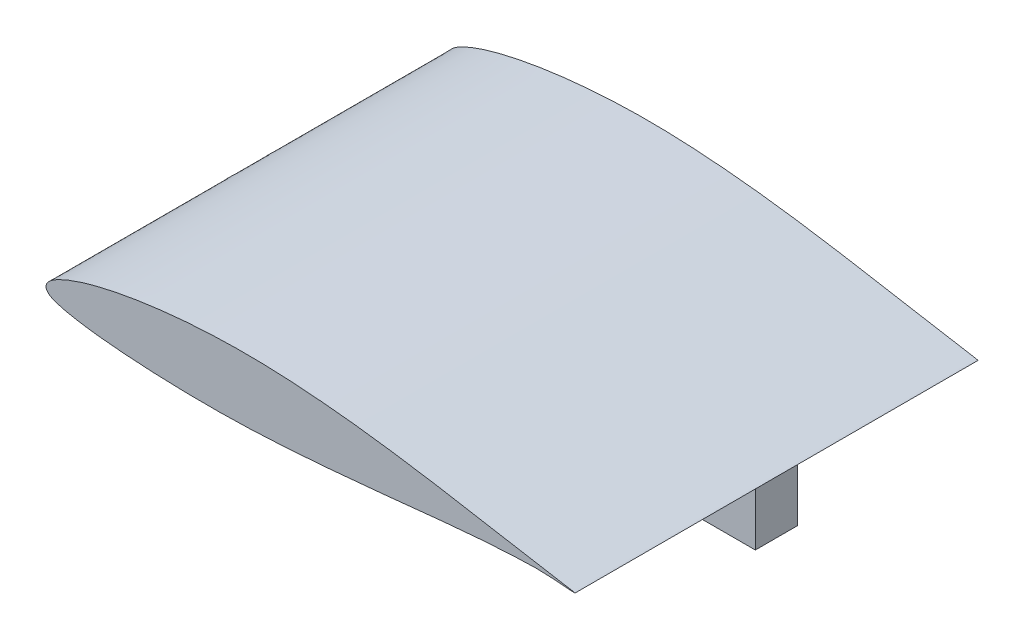
ISO-10303-21;
HEADER;
FILE_DESCRIPTION(('STEP AP214'),'2;1');
FILE_NAME('part.step','',(''),(''),'','','');
FILE_SCHEMA(('AUTOMOTIVE_DESIGN { 1 0 10303 214 1 1 1 1 }'));
ENDSEC;
DATA;
#1=APPLICATION_CONTEXT('core data for automotive mechanical design processes');
#2=APPLICATION_PROTOCOL_DEFINITION('international standard','automotive_design',2000,#1);
#3=PRODUCT_CONTEXT('',#1,'mechanical');
#4=PRODUCT('Part','Part','',(#3));
#5=PRODUCT_RELATED_PRODUCT_CATEGORY('part','',(#4));
#6=PRODUCT_DEFINITION_FORMATION('','',#4);
#7=PRODUCT_DEFINITION_CONTEXT('part definition',#1,'design');
#8=PRODUCT_DEFINITION('design','',#6,#7);
#9=PRODUCT_DEFINITION_SHAPE('','',#8);
#10=(LENGTH_UNIT() NAMED_UNIT(*) SI_UNIT(.MILLI.,.METRE.));
#11=(NAMED_UNIT(*) PLANE_ANGLE_UNIT() SI_UNIT($,.RADIAN.));
#12=(NAMED_UNIT(*) SI_UNIT($,.STERADIAN.) SOLID_ANGLE_UNIT());
#13=UNCERTAINTY_MEASURE_WITH_UNIT(LENGTH_MEASURE(1.E-05),#10,'distance_accuracy_value','');
#14=(GEOMETRIC_REPRESENTATION_CONTEXT(3) GLOBAL_UNCERTAINTY_ASSIGNED_CONTEXT((#13)) GLOBAL_UNIT_ASSIGNED_CONTEXT((#10,
#11,#12)) REPRESENTATION_CONTEXT('',''));
#15=CARTESIAN_POINT('',(0.,0.,0.));
#16=DIRECTION('',(0.,0.,1.));
#17=DIRECTION('',(1.,0.,0.));
#18=AXIS2_PLACEMENT_3D('',#15,#16,#17);
#19=CARTESIAN_POINT('',(100.,0.,76.2));
#20=CARTESIAN_POINT('',(100.014170612076,0.0802355680645147,76.2));
#21=CARTESIAN_POINT('',(94.2513787386886,0.987922299528687,76.2));
#22=CARTESIAN_POINT('',(90.2528823393263,1.70531359571479,76.2));
#23=CARTESIAN_POINT('',(85.0126298463887,2.62809451049511,76.2));
#24=CARTESIAN_POINT('',(80.0978733834121,3.49360580103763,76.2));
#25=CARTESIAN_POINT('',(75.08626384572,4.3518511124799,76.2));
#26=CARTESIAN_POINT('',(70.0899657920977,5.16318276739783,76.2));
#27=CARTESIAN_POINT('',(65.0788997815026,5.91295297026844,76.2));
#28=CARTESIAN_POINT('',(60.0607717531889,6.57756010593191,76.2));
#29=CARTESIAN_POINT('',(55.035513209883,7.14691319987309,76.2));
#30=CARTESIAN_POINT('',(50.002522389741,7.58284746732128,76.2));
#31=CARTESIAN_POINT('',(44.9667855949776,7.92273212264344,76.2));
#32=CARTESIAN_POINT('',(39.9247260923384,8.08968450716043,76.2));
#33=CARTESIAN_POINT('',(34.8802854626848,8.09045706042397,76.2));
#34=CARTESIAN_POINT('',(29.8355416107328,7.90223367255034,76.2));
#35=CARTESIAN_POINT('',(24.7925671750228,7.53116390095195,76.2));
#36=CARTESIAN_POINT('',(19.752173403588,6.9630929580199,76.2));
#37=CARTESIAN_POINT('',(14.7144159850358,6.18032644748818,76.2));
#38=CARTESIAN_POINT('',(10.5311953688536,5.30031427403274,76.2));
#39=CARTESIAN_POINT('',(7.2000089786032,4.39841068347721,76.2));
#40=CARTESIAN_POINT('',(4.69274087463174,3.57023875238834,76.2));
#41=CARTESIAN_POINT('',(2.61801180984859,2.68942559379691,76.2));
#42=CARTESIAN_POINT('',(1.24233146474951,1.90086330766204,76.2));
#43=CARTESIAN_POINT('',(0.62785372555261,1.389017566799,76.2));
#44=CARTESIAN_POINT('',(0.150010633222135,0.895649072609858,76.2));
#45=CARTESIAN_POINT('',(-0.232912194690845,-0.0403967273184171,76.2));
#46=CARTESIAN_POINT('',(0.445072625408608,-0.743635565464356,76.2));
#47=CARTESIAN_POINT('',(1.00461536523782,-1.08960973246923,76.2));
#48=CARTESIAN_POINT('',(1.6909830569623,-1.40687657859132,76.2));
#49=CARTESIAN_POINT('',(3.13471178954102,-1.85123526856676,76.2));
#50=CARTESIAN_POINT('',(5.2530393591784,-2.29801568892207,76.2));
#51=CARTESIAN_POINT('',(7.77242069880457,-2.69943017094629,76.2));
#52=CARTESIAN_POINT('',(11.1031895892123,-3.10430685655371,76.2));
#53=CARTESIAN_POINT('',(15.2552831112773,-3.46844948271059,76.2));
#54=CARTESIAN_POINT('',(20.2303760452594,-3.7658553603725,76.2));
#55=CARTESIAN_POINT('',(25.197065528373,-3.93635761837658,76.2));
#56=CARTESIAN_POINT('',(30.1571302193971,-4.00212887099721,76.2));
#57=CARTESIAN_POINT('',(35.1171580754506,-3.95900552316446,76.2));
#58=CARTESIAN_POINT('',(40.0765072798799,-3.79516179753949,76.2));
#59=CARTESIAN_POINT('',(45.0396701822184,-3.52806165927051,76.2));
#60=CARTESIAN_POINT('',(50.0039593179771,-3.17474110651785,76.2));
#61=CARTESIAN_POINT('',(54.9729843905619,-2.75476065904624,76.2));
#62=CARTESIAN_POINT('',(59.9453585339621,-2.27374874279989,76.2));
#63=CARTESIAN_POINT('',(64.9299596006109,-1.81576012468662,76.2));
#64=CARTESIAN_POINT('',(69.9147136518121,-1.2535452669803,76.2));
#65=CARTESIAN_POINT('',(74.9074278185698,-0.758100622870828,76.2));
#66=CARTESIAN_POINT('',(79.930586701521,-0.297188344024867,76.2));
#67=CARTESIAN_POINT('',(84.8732501786619,0.0994656121755126,76.2));
#68=CARTESIAN_POINT('',(90.1543016761278,0.343218326510209,76.2));
#69=CARTESIAN_POINT('',(94.2140904280993,0.501588878716901,76.2));
#70=CARTESIAN_POINT('',(99.9858869882734,-0.0799094285351732,76.2));
#71=CARTESIAN_POINT('',(100.,0.,76.2));
#72=B_SPLINE_CURVE_WITH_KNOTS('',3,(#19,#20,#21,#22,#23,#24,#25,#26,#27,#28,#29,#30,#31,#32,#33,
#34,#35,#36,#37,#38,#39,#40,#41,#42,#43,#44,#45,#46,#47,#48,#49,#50,#51,#52,#53,#54,#55,#56,#57,
#58,#59,#60,#61,#62,#63,#64,#65,#66,#67,#68,#69,#70,#71),.UNSPECIFIED.,.T.,.F.,(4,1,1,1,1,1,1,1,
1,1,1,1,1,1,1,1,1,1,1,1,1,1,1,1,1,1,1,1,1,1,1,1,1,1,1,1,1,1,1,1,1,1,1,1,1,1,1,1,1,1,4),(0.,
0.0248401600611186,0.0496463377780271,0.074494465889176,0.0993722184500314,0.124275131601442,
0.149177344479998,0.17407575109908,0.198956347188206,0.223811552141009,0.24863208011981,
0.273434063374411,0.298217341355184,0.322996695872583,0.347793082809583,0.372630344631579,
0.397533352832358,0.422557523624735,0.447773674833146,0.460511709195307,0.473423431452883,
0.486680029949691,0.493678335237496,0.496723305930385,0.498392544685542,0.503909017545475,
0.509291639706998,0.510852916826505,0.513717227633189,0.520364252182127,0.53310336730154,
0.545593679011817,0.557974245778616,0.582563734905974,0.607033396930618,0.63144930352205,
0.655827750547501,0.680164809757272,0.704574632581273,0.728980583418809,0.753442063272876,
0.777949314003769,0.802501977795434,0.827094468513553,0.851753396926096,0.876439602756972,
0.901138992044575,0.925852145633311,0.950560092379754,0.975260809599925,1.),.UNSPECIFIED.);
#73=DIRECTION('',(0.,0.,-1.));
#74=VECTOR('',#73,1.);
#75=SURFACE_OF_LINEAR_EXTRUSION('',#72,#74);
#76=CARTESIAN_POINT('',(100.,0.,0.));
#77=CARTESIAN_POINT('',(100.014170612076,0.0802355680645147,0.));
#78=CARTESIAN_POINT('',(94.2513787386886,0.987922299528687,0.));
#79=CARTESIAN_POINT('',(90.2528823393263,1.70531359571479,0.));
#80=CARTESIAN_POINT('',(85.0126298463887,2.62809451049511,0.));
#81=CARTESIAN_POINT('',(80.0978733834121,3.49360580103763,0.));
#82=CARTESIAN_POINT('',(75.08626384572,4.3518511124799,0.));
#83=CARTESIAN_POINT('',(70.0899657920977,5.16318276739783,0.));
#84=CARTESIAN_POINT('',(65.0788997815026,5.91295297026844,0.));
#85=CARTESIAN_POINT('',(60.0607717531889,6.57756010593191,0.));
#86=CARTESIAN_POINT('',(55.035513209883,7.14691319987309,0.));
#87=CARTESIAN_POINT('',(50.002522389741,7.58284746732128,0.));
#88=CARTESIAN_POINT('',(44.9667855949776,7.92273212264344,0.));
#89=CARTESIAN_POINT('',(39.9247260923384,8.08968450716043,0.));
#90=CARTESIAN_POINT('',(34.8802854626848,8.09045706042397,0.));
#91=CARTESIAN_POINT('',(29.8355416107328,7.90223367255034,0.));
#92=CARTESIAN_POINT('',(24.7925671750228,7.53116390095195,0.));
#93=CARTESIAN_POINT('',(19.752173403588,6.9630929580199,0.));
#94=CARTESIAN_POINT('',(14.7144159850358,6.18032644748818,0.));
#95=CARTESIAN_POINT('',(10.5311953688536,5.30031427403274,0.));
#96=CARTESIAN_POINT('',(7.2000089786032,4.39841068347721,0.));
#97=CARTESIAN_POINT('',(4.69274087463174,3.57023875238834,0.));
#98=CARTESIAN_POINT('',(2.61801180984859,2.68942559379691,0.));
#99=CARTESIAN_POINT('',(1.24233146474951,1.90086330766204,0.));
#100=CARTESIAN_POINT('',(0.62785372555261,1.389017566799,0.));
#101=CARTESIAN_POINT('',(0.150010633222135,0.895649072609858,0.));
#102=CARTESIAN_POINT('',(-0.232912194690845,-0.0403967273184171,0.));
#103=CARTESIAN_POINT('',(0.445072625408608,-0.743635565464356,0.));
#104=CARTESIAN_POINT('',(1.00461536523782,-1.08960973246923,0.));
#105=CARTESIAN_POINT('',(1.6909830569623,-1.40687657859132,0.));
#106=CARTESIAN_POINT('',(3.13471178954102,-1.85123526856676,0.));
#107=CARTESIAN_POINT('',(5.2530393591784,-2.29801568892207,0.));
#108=CARTESIAN_POINT('',(7.77242069880457,-2.69943017094629,0.));
#109=CARTESIAN_POINT('',(11.1031895892123,-3.10430685655371,0.));
#110=CARTESIAN_POINT('',(15.2552831112773,-3.46844948271059,0.));
#111=CARTESIAN_POINT('',(20.2303760452594,-3.7658553603725,0.));
#112=CARTESIAN_POINT('',(25.197065528373,-3.93635761837658,0.));
#113=CARTESIAN_POINT('',(30.1571302193971,-4.00212887099721,0.));
#114=CARTESIAN_POINT('',(35.1171580754506,-3.95900552316446,0.));
#115=CARTESIAN_POINT('',(40.0765072798799,-3.79516179753949,0.));
#116=CARTESIAN_POINT('',(45.0396701822184,-3.52806165927051,0.));
#117=CARTESIAN_POINT('',(50.0039593179771,-3.17474110651785,0.));
#118=CARTESIAN_POINT('',(54.9729843905619,-2.75476065904624,0.));
#119=CARTESIAN_POINT('',(59.9453585339621,-2.27374874279989,0.));
#120=CARTESIAN_POINT('',(64.9299596006109,-1.81576012468662,0.));
#121=CARTESIAN_POINT('',(69.9147136518121,-1.2535452669803,0.));
#122=CARTESIAN_POINT('',(74.9074278185698,-0.758100622870828,0.));
#123=CARTESIAN_POINT('',(79.930586701521,-0.297188344024867,0.));
#124=CARTESIAN_POINT('',(84.8732501786619,0.0994656121755126,0.));
#125=CARTESIAN_POINT('',(90.1543016761278,0.343218326510209,0.));
#126=CARTESIAN_POINT('',(94.2140904280993,0.501588878716901,0.));
#127=CARTESIAN_POINT('',(99.9858869882734,-0.0799094285351732,0.));
#128=CARTESIAN_POINT('',(100.,0.,0.));
#129=B_SPLINE_CURVE_WITH_KNOTS('',3,(#76,#77,#78,#79,#80,#81,#82,#83,#84,#85,#86,#87,#88,#89,
#90,#91,#92,#93,#94,#95,#96,#97,#98,#99,#100,#101,#102,#103,#104,#105,#106,#107,#108,#109,#110,
#111,#112,#113,#114,#115,#116,#117,#118,#119,#120,#121,#122,#123,#124,#125,#126,#127,#128),
.UNSPECIFIED.,.T.,.F.,(4,1,1,1,1,1,1,1,1,1,1,1,1,1,1,1,1,1,1,1,1,1,1,1,1,1,1,1,1,1,1,1,1,1,1,1,
1,1,1,1,1,1,1,1,1,1,1,1,1,1,4),(0.,0.0248401600611186,0.0496463377780271,0.074494465889176,
0.0993722184500314,0.124275131601442,0.149177344479998,0.17407575109908,0.198956347188206,
0.223811552141009,0.24863208011981,0.273434063374411,0.298217341355184,0.322996695872583,
0.347793082809583,0.372630344631579,0.397533352832358,0.422557523624735,0.447773674833146,
0.460511709195307,0.473423431452883,0.486680029949691,0.493678335237496,0.496723305930385,
0.498392544685542,0.503909017545475,0.509291639706998,0.510852916826505,0.513717227633189,
0.520364252182127,0.53310336730154,0.545593679011817,0.557974245778616,0.582563734905974,
0.607033396930618,0.63144930352205,0.655827750547501,0.680164809757272,0.704574632581273,
0.728980583418809,0.753442063272876,0.777949314003769,0.802501977795434,0.827094468513553,
0.851753396926096,0.876439602756972,0.901138992044575,0.925852145633311,0.950560092379754,
0.975260809599925,1.),.UNSPECIFIED.);
#130=CARTESIAN_POINT('',(100.,0.,0.));
#131=VERTEX_POINT('',#130);
#132=EDGE_CURVE('E143',#131,#131,#129,.T.);
#133=ORIENTED_EDGE('',*,*,#132,.T.);
#134=EDGE_LOOP('',(#133));
#135=FACE_BOUND('',#134,.T.);
#136=CARTESIAN_POINT('',(100.,0.,76.2));
#137=VERTEX_POINT('',#136);
#138=EDGE_CURVE('E148',#137,#137,#72,.T.);
#139=ORIENTED_EDGE('',*,*,#138,.F.);
#140=EDGE_LOOP('',(#139));
#141=FACE_BOUND('',#140,.T.);
#142=DIRECTION('',(0.,0.,1.));
#143=VECTOR('',#142,1.);
#144=CARTESIAN_POINT('',(5.11968690379794E-05,-0.000267551796485818,34.1));
#145=LINE('',#144,#143);
#146=CARTESIAN_POINT('',(5.11968690380142E-05,-0.000267551796485723,34.1));
#147=VERTEX_POINT('',#146);
#148=CARTESIAN_POINT('',(5.11968690379794E-05,-0.000267551796485818,42.1));
#149=VERTEX_POINT('',#148);
#150=EDGE_CURVE('E135',#147,#149,#145,.T.);
#151=ORIENTED_EDGE('',*,*,#150,.T.);
#152=CARTESIAN_POINT('',(100.,0.,42.1));
#153=CARTESIAN_POINT('',(100.014170612076,0.0802355680645147,42.1));
#154=CARTESIAN_POINT('',(94.2513787386886,0.987922299528687,42.1));
#155=CARTESIAN_POINT('',(90.2528823393263,1.70531359571479,42.1));
#156=CARTESIAN_POINT('',(85.0126298463887,2.62809451049511,42.1));
#157=CARTESIAN_POINT('',(80.0978733834121,3.49360580103763,42.1));
#158=CARTESIAN_POINT('',(75.08626384572,4.3518511124799,42.1));
#159=CARTESIAN_POINT('',(70.0899657920977,5.16318276739783,42.1));
#160=CARTESIAN_POINT('',(65.0788997815026,5.91295297026844,42.1));
#161=CARTESIAN_POINT('',(60.0607717531889,6.57756010593191,42.1));
#162=CARTESIAN_POINT('',(55.035513209883,7.14691319987309,42.1));
#163=CARTESIAN_POINT('',(50.002522389741,7.58284746732128,42.1));
#164=CARTESIAN_POINT('',(44.9667855949776,7.92273212264344,42.1));
#165=CARTESIAN_POINT('',(39.9247260923384,8.08968450716043,42.1));
#166=CARTESIAN_POINT('',(34.8802854626848,8.09045706042397,42.1));
#167=CARTESIAN_POINT('',(29.8355416107328,7.90223367255034,42.1));
#168=CARTESIAN_POINT('',(24.7925671750228,7.53116390095195,42.1));
#169=CARTESIAN_POINT('',(19.752173403588,6.9630929580199,42.1));
#170=CARTESIAN_POINT('',(14.7144159850358,6.18032644748818,42.1));
#171=CARTESIAN_POINT('',(10.5311953688536,5.30031427403274,42.1));
#172=CARTESIAN_POINT('',(7.2000089786032,4.39841068347721,42.1));
#173=CARTESIAN_POINT('',(4.69274087463174,3.57023875238834,42.1));
#174=CARTESIAN_POINT('',(2.61801180984859,2.68942559379691,42.1));
#175=CARTESIAN_POINT('',(1.24233146474951,1.90086330766204,42.1));
#176=CARTESIAN_POINT('',(0.62785372555261,1.389017566799,42.1));
#177=CARTESIAN_POINT('',(0.150010633222135,0.895649072609858,42.1));
#178=CARTESIAN_POINT('',(-0.232912194690845,-0.0403967273184171,42.1));
#179=CARTESIAN_POINT('',(0.445072625408608,-0.743635565464356,42.1));
#180=CARTESIAN_POINT('',(1.00461536523782,-1.08960973246923,42.1));
#181=CARTESIAN_POINT('',(1.6909830569623,-1.40687657859132,42.1));
#182=CARTESIAN_POINT('',(3.13471178954102,-1.85123526856676,42.1));
#183=CARTESIAN_POINT('',(5.2530393591784,-2.29801568892207,42.1));
#184=CARTESIAN_POINT('',(7.77242069880457,-2.69943017094629,42.1));
#185=CARTESIAN_POINT('',(11.1031895892123,-3.10430685655371,42.1));
#186=CARTESIAN_POINT('',(15.2552831112773,-3.46844948271059,42.1));
#187=CARTESIAN_POINT('',(20.2303760452594,-3.7658553603725,42.1));
#188=CARTESIAN_POINT('',(25.197065528373,-3.93635761837658,42.1));
#189=CARTESIAN_POINT('',(30.1571302193971,-4.00212887099721,42.1));
#190=CARTESIAN_POINT('',(35.1171580754506,-3.95900552316446,42.1));
#191=CARTESIAN_POINT('',(40.0765072798799,-3.79516179753949,42.1));
#192=CARTESIAN_POINT('',(45.0396701822184,-3.52806165927051,42.1));
#193=CARTESIAN_POINT('',(50.0039593179771,-3.17474110651785,42.1));
#194=CARTESIAN_POINT('',(54.9729843905619,-2.75476065904624,42.1));
#195=CARTESIAN_POINT('',(59.9453585339621,-2.27374874279989,42.1));
#196=CARTESIAN_POINT('',(64.9299596006109,-1.81576012468662,42.1));
#197=CARTESIAN_POINT('',(69.9147136518121,-1.2535452669803,42.1));
#198=CARTESIAN_POINT('',(74.9074278185698,-0.758100622870828,42.1));
#199=CARTESIAN_POINT('',(79.930586701521,-0.297188344024867,42.1));
#200=CARTESIAN_POINT('',(84.8732501786619,0.0994656121755126,42.1));
#201=CARTESIAN_POINT('',(90.1543016761278,0.343218326510209,42.1));
#202=CARTESIAN_POINT('',(94.2140904280993,0.501588878716901,42.1));
#203=CARTESIAN_POINT('',(99.9858869882734,-0.0799094285351732,42.1));
#204=CARTESIAN_POINT('',(100.,0.,42.1));
#205=B_SPLINE_CURVE_WITH_KNOTS('',3,(#152,#153,#154,#155,#156,#157,#158,#159,#160,#161,#162,
#163,#164,#165,#166,#167,#168,#169,#170,#171,#172,#173,#174,#175,#176,#177,#178,#179,#180,#181,
#182,#183,#184,#185,#186,#187,#188,#189,#190,#191,#192,#193,#194,#195,#196,#197,#198,#199,#200,
#201,#202,#203,#204),.UNSPECIFIED.,.T.,.F.,(4,1,1,1,1,1,1,1,1,1,1,1,1,1,1,1,1,1,1,1,1,1,1,1,1,1,
1,1,1,1,1,1,1,1,1,1,1,1,1,1,1,1,1,1,1,1,1,1,1,1,4),(0.,0.0248401600611186,0.0496463377780271,
0.074494465889176,0.0993722184500314,0.124275131601442,0.149177344479998,0.17407575109908,
0.198956347188206,0.223811552141009,0.24863208011981,0.273434063374411,0.298217341355184,
0.322996695872583,0.347793082809583,0.372630344631579,0.397533352832358,0.422557523624735,
0.447773674833146,0.460511709195307,0.473423431452883,0.486680029949691,0.493678335237496,
0.496723305930385,0.498392544685542,0.503909017545475,0.509291639706998,0.510852916826505,
0.513717227633189,0.520364252182127,0.53310336730154,0.545593679011817,0.557974245778616,
0.582563734905974,0.607033396930618,0.63144930352205,0.655827750547501,0.680164809757272,
0.704574632581273,0.728980583418809,0.753442063272876,0.777949314003769,0.802501977795434,
0.827094468513553,0.851753396926096,0.876439602756972,0.901138992044575,0.925852145633311,
0.950560092379754,0.975260809599925,1.),.UNSPECIFIED.);
#206=CARTESIAN_POINT('',(100.000050626666,0.000526352267182232,42.1));
#207=VERTEX_POINT('',#206);
#208=EDGE_CURVE('E111',#207,#149,#205,.F.);
#209=ORIENTED_EDGE('',*,*,#208,.F.);
#210=DIRECTION('',(0.,0.,1.));
#211=VECTOR('',#210,1.);
#212=CARTESIAN_POINT('',(100.000052030593,0.000596232654725544,34.1));
#213=LINE('',#212,#211);
#214=CARTESIAN_POINT('',(100.000052030593,0.000596232363180802,34.1));
#215=VERTEX_POINT('',#214);
#216=EDGE_CURVE('E83',#215,#207,#213,.T.);
#217=ORIENTED_EDGE('',*,*,#216,.F.);
#218=CARTESIAN_POINT('',(100.,0.,34.1));
#219=CARTESIAN_POINT('',(100.014170612076,0.0802355680645147,34.1));
#220=CARTESIAN_POINT('',(94.2513787386886,0.987922299528687,34.1));
#221=CARTESIAN_POINT('',(90.2528823393263,1.70531359571479,34.1));
#222=CARTESIAN_POINT('',(85.0126298463887,2.62809451049511,34.1));
#223=CARTESIAN_POINT('',(80.0978733834121,3.49360580103763,34.1));
#224=CARTESIAN_POINT('',(75.08626384572,4.3518511124799,34.1));
#225=CARTESIAN_POINT('',(70.0899657920977,5.16318276739783,34.1));
#226=CARTESIAN_POINT('',(65.0788997815026,5.91295297026844,34.1));
#227=CARTESIAN_POINT('',(60.0607717531889,6.57756010593191,34.1));
#228=CARTESIAN_POINT('',(55.035513209883,7.14691319987309,34.1));
#229=CARTESIAN_POINT('',(50.002522389741,7.58284746732128,34.1));
#230=CARTESIAN_POINT('',(44.9667855949776,7.92273212264344,34.1));
#231=CARTESIAN_POINT('',(39.9247260923384,8.08968450716043,34.1));
#232=CARTESIAN_POINT('',(34.8802854626848,8.09045706042397,34.1));
#233=CARTESIAN_POINT('',(29.8355416107328,7.90223367255034,34.1));
#234=CARTESIAN_POINT('',(24.7925671750228,7.53116390095195,34.1));
#235=CARTESIAN_POINT('',(19.752173403588,6.9630929580199,34.1));
#236=CARTESIAN_POINT('',(14.7144159850358,6.18032644748818,34.1));
#237=CARTESIAN_POINT('',(10.5311953688536,5.30031427403274,34.1));
#238=CARTESIAN_POINT('',(7.2000089786032,4.39841068347721,34.1));
#239=CARTESIAN_POINT('',(4.69274087463174,3.57023875238834,34.1));
#240=CARTESIAN_POINT('',(2.61801180984859,2.68942559379691,34.1));
#241=CARTESIAN_POINT('',(1.24233146474951,1.90086330766204,34.1));
#242=CARTESIAN_POINT('',(0.62785372555261,1.389017566799,34.1));
#243=CARTESIAN_POINT('',(0.150010633222135,0.895649072609858,34.1));
#244=CARTESIAN_POINT('',(-0.232912194690845,-0.0403967273184171,34.1));
#245=CARTESIAN_POINT('',(0.445072625408608,-0.743635565464356,34.1));
#246=CARTESIAN_POINT('',(1.00461536523782,-1.08960973246923,34.1));
#247=CARTESIAN_POINT('',(1.6909830569623,-1.40687657859132,34.1));
#248=CARTESIAN_POINT('',(3.13471178954102,-1.85123526856676,34.1));
#249=CARTESIAN_POINT('',(5.2530393591784,-2.29801568892207,34.1));
#250=CARTESIAN_POINT('',(7.77242069880457,-2.69943017094629,34.1));
#251=CARTESIAN_POINT('',(11.1031895892123,-3.10430685655371,34.1));
#252=CARTESIAN_POINT('',(15.2552831112773,-3.46844948271059,34.1));
#253=CARTESIAN_POINT('',(20.2303760452594,-3.7658553603725,34.1));
#254=CARTESIAN_POINT('',(25.197065528373,-3.93635761837658,34.1));
#255=CARTESIAN_POINT('',(30.1571302193971,-4.00212887099721,34.1));
#256=CARTESIAN_POINT('',(35.1171580754506,-3.95900552316446,34.1));
#257=CARTESIAN_POINT('',(40.0765072798799,-3.79516179753949,34.1));
#258=CARTESIAN_POINT('',(45.0396701822184,-3.52806165927051,34.1));
#259=CARTESIAN_POINT('',(50.0039593179771,-3.17474110651785,34.1));
#260=CARTESIAN_POINT('',(54.9729843905619,-2.75476065904624,34.1));
#261=CARTESIAN_POINT('',(59.9453585339621,-2.27374874279989,34.1));
#262=CARTESIAN_POINT('',(64.9299596006109,-1.81576012468662,34.1));
#263=CARTESIAN_POINT('',(69.9147136518121,-1.2535452669803,34.1));
#264=CARTESIAN_POINT('',(74.9074278185698,-0.758100622870828,34.1));
#265=CARTESIAN_POINT('',(79.930586701521,-0.297188344024867,34.1));
#266=CARTESIAN_POINT('',(84.8732501786619,0.0994656121755126,34.1));
#267=CARTESIAN_POINT('',(90.1543016761278,0.343218326510209,34.1));
#268=CARTESIAN_POINT('',(94.2140904280993,0.501588878716901,34.1));
#269=CARTESIAN_POINT('',(99.9858869882734,-0.0799094285351732,34.1));
#270=CARTESIAN_POINT('',(100.,0.,34.1));
#271=B_SPLINE_CURVE_WITH_KNOTS('',3,(#218,#219,#220,#221,#222,#223,#224,#225,#226,#227,#228,
#229,#230,#231,#232,#233,#234,#235,#236,#237,#238,#239,#240,#241,#242,#243,#244,#245,#246,#247,
#248,#249,#250,#251,#252,#253,#254,#255,#256,#257,#258,#259,#260,#261,#262,#263,#264,#265,#266,
#267,#268,#269,#270),.UNSPECIFIED.,.T.,.F.,(4,1,1,1,1,1,1,1,1,1,1,1,1,1,1,1,1,1,1,1,1,1,1,1,1,1,
1,1,1,1,1,1,1,1,1,1,1,1,1,1,1,1,1,1,1,1,1,1,1,1,4),(0.,0.0248401600611186,0.0496463377780271,
0.074494465889176,0.0993722184500314,0.124275131601442,0.149177344479998,0.17407575109908,
0.198956347188206,0.223811552141009,0.24863208011981,0.273434063374411,0.298217341355184,
0.322996695872583,0.347793082809583,0.372630344631579,0.397533352832358,0.422557523624735,
0.447773674833146,0.460511709195307,0.473423431452883,0.486680029949691,0.493678335237496,
0.496723305930385,0.498392544685542,0.503909017545475,0.509291639706998,0.510852916826505,
0.513717227633189,0.520364252182127,0.53310336730154,0.545593679011817,0.557974245778616,
0.582563734905974,0.607033396930618,0.63144930352205,0.655827750547501,0.680164809757272,
0.704574632581273,0.728980583418809,0.753442063272876,0.777949314003769,0.802501977795434,
0.827094468513553,0.851753396926096,0.876439602756972,0.901138992044575,0.925852145633311,
0.950560092379754,0.975260809599925,1.),.UNSPECIFIED.);
#272=CARTESIAN_POINT('',(99.5165882488397,0.000592056569787649,34.1));
#273=VERTEX_POINT('',#272);
#274=EDGE_CURVE('E98',#215,#273,#271,.F.);
#275=ORIENTED_EDGE('',*,*,#274,.T.);
#276=DIRECTION('',(0.,0.,-1.));
#277=VECTOR('',#276,1.);
#278=CARTESIAN_POINT('',(99.5165882488397,0.000592056569787649,76.2));
#279=LINE('',#278,#277);
#280=CARTESIAN_POINT('',(99.5165882488397,0.000592056569787649,38.1));
#281=VERTEX_POINT('',#280);
#282=EDGE_CURVE('E100',#273,#281,#279,.F.);
#283=ORIENTED_EDGE('',*,*,#282,.T.);
#284=CARTESIAN_POINT('',(100.,0.,38.1));
#285=CARTESIAN_POINT('',(100.014170612076,0.0802355680645147,38.1));
#286=CARTESIAN_POINT('',(94.2513787386886,0.987922299528687,38.1));
#287=CARTESIAN_POINT('',(90.2528823393263,1.70531359571479,38.1));
#288=CARTESIAN_POINT('',(85.0126298463887,2.62809451049511,38.1));
#289=CARTESIAN_POINT('',(80.0978733834121,3.49360580103763,38.1));
#290=CARTESIAN_POINT('',(75.08626384572,4.3518511124799,38.1));
#291=CARTESIAN_POINT('',(70.0899657920977,5.16318276739783,38.1));
#292=CARTESIAN_POINT('',(65.0788997815026,5.91295297026844,38.1));
#293=CARTESIAN_POINT('',(60.0607717531889,6.57756010593191,38.1));
#294=CARTESIAN_POINT('',(55.035513209883,7.14691319987309,38.1));
#295=CARTESIAN_POINT('',(50.002522389741,7.58284746732128,38.1));
#296=CARTESIAN_POINT('',(44.9667855949776,7.92273212264344,38.1));
#297=CARTESIAN_POINT('',(39.9247260923384,8.08968450716043,38.1));
#298=CARTESIAN_POINT('',(34.8802854626848,8.09045706042397,38.1));
#299=CARTESIAN_POINT('',(29.8355416107328,7.90223367255034,38.1));
#300=CARTESIAN_POINT('',(24.7925671750228,7.53116390095195,38.1));
#301=CARTESIAN_POINT('',(19.752173403588,6.9630929580199,38.1));
#302=CARTESIAN_POINT('',(14.7144159850358,6.18032644748818,38.1));
#303=CARTESIAN_POINT('',(10.5311953688536,5.30031427403274,38.1));
#304=CARTESIAN_POINT('',(7.2000089786032,4.39841068347721,38.1));
#305=CARTESIAN_POINT('',(4.69274087463174,3.57023875238834,38.1));
#306=CARTESIAN_POINT('',(2.61801180984859,2.68942559379691,38.1));
#307=CARTESIAN_POINT('',(1.24233146474951,1.90086330766204,38.1));
#308=CARTESIAN_POINT('',(0.62785372555261,1.389017566799,38.1));
#309=CARTESIAN_POINT('',(0.150010633222135,0.895649072609858,38.1));
#310=CARTESIAN_POINT('',(-0.232912194690845,-0.0403967273184171,38.1));
#311=CARTESIAN_POINT('',(0.445072625408608,-0.743635565464356,38.1));
#312=CARTESIAN_POINT('',(1.00461536523782,-1.08960973246923,38.1));
#313=CARTESIAN_POINT('',(1.6909830569623,-1.40687657859132,38.1));
#314=CARTESIAN_POINT('',(3.13471178954102,-1.85123526856676,38.1));
#315=CARTESIAN_POINT('',(5.2530393591784,-2.29801568892207,38.1));
#316=CARTESIAN_POINT('',(7.77242069880457,-2.69943017094629,38.1));
#317=CARTESIAN_POINT('',(11.1031895892123,-3.10430685655371,38.1));
#318=CARTESIAN_POINT('',(15.2552831112773,-3.46844948271059,38.1));
#319=CARTESIAN_POINT('',(20.2303760452594,-3.7658553603725,38.1));
#320=CARTESIAN_POINT('',(25.197065528373,-3.93635761837658,38.1));
#321=CARTESIAN_POINT('',(30.1571302193971,-4.00212887099721,38.1));
#322=CARTESIAN_POINT('',(35.1171580754506,-3.95900552316446,38.1));
#323=CARTESIAN_POINT('',(40.0765072798799,-3.79516179753949,38.1));
#324=CARTESIAN_POINT('',(45.0396701822184,-3.52806165927051,38.1));
#325=CARTESIAN_POINT('',(50.0039593179771,-3.17474110651785,38.1));
#326=CARTESIAN_POINT('',(54.9729843905619,-2.75476065904624,38.1));
#327=CARTESIAN_POINT('',(59.9453585339621,-2.27374874279989,38.1));
#328=CARTESIAN_POINT('',(64.9299596006109,-1.81576012468662,38.1));
#329=CARTESIAN_POINT('',(69.9147136518121,-1.2535452669803,38.1));
#330=CARTESIAN_POINT('',(74.9074278185698,-0.758100622870828,38.1));
#331=CARTESIAN_POINT('',(79.930586701521,-0.297188344024867,38.1));
#332=CARTESIAN_POINT('',(84.8732501786619,0.0994656121755126,38.1));
#333=CARTESIAN_POINT('',(90.1543016761278,0.343218326510209,38.1));
#334=CARTESIAN_POINT('',(94.2140904280993,0.501588878716901,38.1));
#335=CARTESIAN_POINT('',(99.9858869882734,-0.0799094285351732,38.1));
#336=CARTESIAN_POINT('',(100.,0.,38.1));
#337=B_SPLINE_CURVE_WITH_KNOTS('',3,(#284,#285,#286,#287,#288,#289,#290,#291,#292,#293,#294,
#295,#296,#297,#298,#299,#300,#301,#302,#303,#304,#305,#306,#307,#308,#309,#310,#311,#312,#313,
#314,#315,#316,#317,#318,#319,#320,#321,#322,#323,#324,#325,#326,#327,#328,#329,#330,#331,#332,
#333,#334,#335,#336),.UNSPECIFIED.,.T.,.F.,(4,1,1,1,1,1,1,1,1,1,1,1,1,1,1,1,1,1,1,1,1,1,1,1,1,1,
1,1,1,1,1,1,1,1,1,1,1,1,1,1,1,1,1,1,1,1,1,1,1,1,4),(0.,0.0248401600611186,0.0496463377780271,
0.074494465889176,0.0993722184500314,0.124275131601442,0.149177344479998,0.17407575109908,
0.198956347188206,0.223811552141009,0.24863208011981,0.273434063374411,0.298217341355184,
0.322996695872583,0.347793082809583,0.372630344631579,0.397533352832358,0.422557523624735,
0.447773674833146,0.460511709195307,0.473423431452883,0.486680029949691,0.493678335237496,
0.496723305930385,0.498392544685542,0.503909017545475,0.509291639706998,0.510852916826505,
0.513717227633189,0.520364252182127,0.53310336730154,0.545593679011817,0.557974245778616,
0.582563734905974,0.607033396930618,0.63144930352205,0.655827750547501,0.680164809757272,
0.704574632581273,0.728980583418809,0.753442063272876,0.777949314003769,0.802501977795434,
0.827094468513553,0.851753396926096,0.876439602756972,0.901138992044575,0.925852145633311,
0.950560092379754,0.975260809599925,1.),.UNSPECIFIED.);
#338=CARTESIAN_POINT('',(83.8191790957514,0.000456464791407155,38.1));
#339=VERTEX_POINT('',#338);
#340=EDGE_CURVE('E49',#281,#339,#337,.F.);
#341=ORIENTED_EDGE('',*,*,#340,.T.);
#342=DIRECTION('',(0.,0.,-1.));
#343=VECTOR('',#342,1.);
#344=CARTESIAN_POINT('',(83.8191790957514,0.000456464791410313,76.2));
#345=LINE('',#344,#343);
#346=CARTESIAN_POINT('',(83.8191790957514,0.000456464791410313,34.1));
#347=VERTEX_POINT('',#346);
#348=EDGE_CURVE('E70',#339,#347,#345,.T.);
#349=ORIENTED_EDGE('',*,*,#348,.T.);
#350=EDGE_CURVE('E56',#347,#147,#271,.F.);
#351=ORIENTED_EDGE('',*,*,#350,.T.);
#352=EDGE_LOOP('',(#151,#209,#217,#275,#283,#341,#349,#351));
#353=FACE_BOUND('',#352,.T.);
#354=ADVANCED_FACE('F45',(#135,#141,#353),#75,.F.);
#355=CARTESIAN_POINT('',(0.150635326472061,0.784712621227575,76.2));
#356=DIRECTION('',(0.,0.,-1.));
#357=DIRECTION('',(-1.,0.,0.));
#358=AXIS2_PLACEMENT_3D('',#355,#356,#357);
#359=PLANE('',#358);
#360=ORIENTED_EDGE('',*,*,#138,.T.);
#361=EDGE_LOOP('',(#360));
#362=FACE_BOUND('',#361,.T.);
#363=ADVANCED_FACE('F211',(#362),#359,.F.);
#364=CARTESIAN_POINT('',(0.150635326472061,0.784712621227575,0.));
#365=DIRECTION('',(0.,0.,-1.));
#366=DIRECTION('',(-1.,0.,0.));
#367=AXIS2_PLACEMENT_3D('',#364,#365,#366);
#368=PLANE('',#367);
#369=ORIENTED_EDGE('',*,*,#132,.F.);
#370=EDGE_LOOP('',(#369));
#371=FACE_BOUND('',#370,.T.);
#372=ADVANCED_FACE('F217',(#371),#368,.T.);
#373=CARTESIAN_POINT('',(5.11968690379794E-05,-0.000267551796485818,34.1));
#374=DIRECTION('',(-8.63784443977563E-06,0.999999999962694,0.));
#375=DIRECTION('',(-0.999999999962694,-8.63784443977563E-06,0.));
#376=AXIS2_PLACEMENT_3D('',#373,#374,#375);
#377=PLANE('',#376);
#378=DIRECTION('',(-0.999999999962694,-8.63784443977563E-06,0.));
#379=VECTOR('',#378,1.);
#380=CARTESIAN_POINT('',(5.11968690379794E-05,-0.000267551796485818,38.1));
#381=LINE('',#380,#379);
#382=EDGE_CURVE('E11',#281,#339,#381,.T.);
#383=ORIENTED_EDGE('',*,*,#382,.F.);
#384=ORIENTED_EDGE('',*,*,#282,.F.);
#385=DIRECTION('',(-0.999999999962694,-8.63784443977563E-06,0.));
#386=VECTOR('',#385,1.);
#387=CARTESIAN_POINT('',(5.11968690379794E-05,-0.000267551796485818,34.1));
#388=LINE('',#387,#386);
#389=EDGE_CURVE('E109',#273,#347,#388,.T.);
#390=ORIENTED_EDGE('',*,*,#389,.T.);
#391=ORIENTED_EDGE('',*,*,#348,.F.);
#392=EDGE_LOOP('',(#383,#384,#390,#391));
#393=FACE_BOUND('',#392,.T.);
#394=ADVANCED_FACE('F108',(#393),#377,.T.);
#395=CARTESIAN_POINT('',(0.,0.,34.1));
#396=DIRECTION('',(0.,0.,-1.));
#397=DIRECTION('',(-1.,0.,0.));
#398=AXIS2_PLACEMENT_3D('',#395,#396,#397);
#399=PLANE('',#398);
#400=CARTESIAN_POINT('',(15.800051196869,-7.00026755179648,34.1));
#401=DIRECTION('',(0.,0.,-1.));
#402=DIRECTION('',(-1.,0.,0.));
#403=AXIS2_PLACEMENT_3D('',#400,#401,#402);
#404=CIRCLE('',#403,2.);
#405=CARTESIAN_POINT('',(13.800051196869,-7.00026755179648,34.1));
#406=VERTEX_POINT('',#405);
#407=EDGE_CURVE('E249',#406,#406,#404,.T.);
#408=ORIENTED_EDGE('',*,*,#407,.F.);
#409=EDGE_LOOP('',(#408));
#410=FACE_BOUND('',#409,.T.);
#411=CARTESIAN_POINT('',(85.8000511968688,-7.00026356069285,34.1));
#412=DIRECTION('',(0.,0.,-1.));
#413=DIRECTION('',(-1.,0.,0.));
#414=AXIS2_PLACEMENT_3D('',#411,#412,#413);
#415=CIRCLE('',#414,2.);
#416=CARTESIAN_POINT('',(83.8000511968688,-7.00026356069285,34.1));
#417=VERTEX_POINT('',#416);
#418=EDGE_CURVE('E252',#417,#417,#415,.T.);
#419=ORIENTED_EDGE('',*,*,#418,.F.);
#420=EDGE_LOOP('',(#419));
#421=FACE_BOUND('',#420,.T.);
#422=ORIENTED_EDGE('',*,*,#350,.F.);
#423=ORIENTED_EDGE('',*,*,#389,.F.);
#424=ORIENTED_EDGE('',*,*,#274,.F.);
#425=DIRECTION('',(8.33651580638336E-08,0.999999999999997,0.));
#426=VECTOR('',#425,1.);
#427=CARTESIAN_POINT('',(100.000051196869,-10.0002675517965,34.1));
#428=LINE('',#427,#426);
#429=CARTESIAN_POINT('',(100.000051196869,-10.0002675517965,34.1));
#430=VERTEX_POINT('',#429);
#431=EDGE_CURVE('E132',#430,#215,#428,.T.);
#432=ORIENTED_EDGE('',*,*,#431,.F.);
#433=DIRECTION('',(1.,0.,0.));
#434=VECTOR('',#433,1.);
#435=CARTESIAN_POINT('',(5.1196869039204E-05,-10.0002675517965,34.1));
#436=LINE('',#435,#434);
#437=CARTESIAN_POINT('',(5.1196869039204E-05,-10.0002675517965,34.1));
#438=VERTEX_POINT('',#437);
#439=EDGE_CURVE('E122',#438,#430,#436,.T.);
#440=ORIENTED_EDGE('',*,*,#439,.F.);
#441=DIRECTION('',(0.,-1.,0.));
#442=VECTOR('',#441,1.);
#443=CARTESIAN_POINT('',(5.11968690379794E-05,-0.000267551796485818,34.1));
#444=LINE('',#443,#442);
#445=EDGE_CURVE('E116',#147,#438,#444,.T.);
#446=ORIENTED_EDGE('',*,*,#445,.F.);
#447=EDGE_LOOP('',(#422,#423,#424,#432,#440,#446));
#448=FACE_BOUND('',#447,.T.);
#449=ADVANCED_FACE('F113',(#410,#421,#448),#399,.T.);
#450=CARTESIAN_POINT('',(0.,0.,42.1));
#451=DIRECTION('',(0.,0.,-1.));
#452=DIRECTION('',(-1.,0.,0.));
#453=AXIS2_PLACEMENT_3D('',#450,#451,#452);
#454=PLANE('',#453);
#455=CARTESIAN_POINT('',(15.800051196869,-7.00026755179648,42.1));
#456=DIRECTION('',(0.,0.,1.));
#457=DIRECTION('',(1.,0.,0.));
#458=AXIS2_PLACEMENT_3D('',#455,#456,#457);
#459=CIRCLE('',#458,2.);
#460=CARTESIAN_POINT('',(17.800051196869,-7.00026755179648,42.1));
#461=VERTEX_POINT('',#460);
#462=EDGE_CURVE('E254',#461,#461,#459,.T.);
#463=ORIENTED_EDGE('',*,*,#462,.F.);
#464=EDGE_LOOP('',(#463));
#465=FACE_BOUND('',#464,.T.);
#466=CARTESIAN_POINT('',(85.8000511968688,-7.00026356069285,42.1));
#467=DIRECTION('',(0.,0.,1.));
#468=DIRECTION('',(1.,0.,0.));
#469=AXIS2_PLACEMENT_3D('',#466,#467,#468);
#470=CIRCLE('',#469,2.);
#471=CARTESIAN_POINT('',(87.8000511968688,-7.00026356069285,42.1));
#472=VERTEX_POINT('',#471);
#473=EDGE_CURVE('E260',#472,#472,#470,.T.);
#474=ORIENTED_EDGE('',*,*,#473,.F.);
#475=EDGE_LOOP('',(#474));
#476=FACE_BOUND('',#475,.T.);
#477=ORIENTED_EDGE('',*,*,#208,.T.);
#478=DIRECTION('',(0.,-1.,0.));
#479=VECTOR('',#478,1.);
#480=CARTESIAN_POINT('',(5.11968690379794E-05,-0.000267551796485818,42.1));
#481=LINE('',#480,#479);
#482=CARTESIAN_POINT('',(5.1196869039204E-05,-10.0002675517965,42.1));
#483=VERTEX_POINT('',#482);
#484=EDGE_CURVE('E194',#149,#483,#481,.T.);
#485=ORIENTED_EDGE('',*,*,#484,.T.);
#486=DIRECTION('',(1.,0.,0.));
#487=VECTOR('',#486,1.);
#488=CARTESIAN_POINT('',(5.1196869039204E-05,-10.0002675517965,42.1));
#489=LINE('',#488,#487);
#490=CARTESIAN_POINT('',(100.000051196869,-10.0002675517965,42.1));
#491=VERTEX_POINT('',#490);
#492=EDGE_CURVE('E125',#483,#491,#489,.T.);
#493=ORIENTED_EDGE('',*,*,#492,.T.);
#494=DIRECTION('',(8.33651580638336E-08,0.999999999999997,0.));
#495=VECTOR('',#494,1.);
#496=CARTESIAN_POINT('',(100.000051196869,-10.0002675517965,42.1));
#497=LINE('',#496,#495);
#498=EDGE_CURVE('E117',#491,#207,#497,.T.);
#499=ORIENTED_EDGE('',*,*,#498,.T.);
#500=EDGE_LOOP('',(#477,#485,#493,#499));
#501=FACE_BOUND('',#500,.T.);
#502=ADVANCED_FACE('F193',(#465,#476,#501),#454,.F.);
#503=CARTESIAN_POINT('',(100.000051196869,-10.0002675517965,34.1));
#504=DIRECTION('',(0.999999999999997,-8.33651580638336E-08,0.));
#505=DIRECTION('',(8.33651580638336E-08,0.999999999999997,0.));
#506=AXIS2_PLACEMENT_3D('',#503,#504,#505);
#507=PLANE('',#506);
#508=ORIENTED_EDGE('',*,*,#216,.T.);
#509=ORIENTED_EDGE('',*,*,#498,.F.);
#510=DIRECTION('',(0.,0.,1.));
#511=VECTOR('',#510,1.);
#512=CARTESIAN_POINT('',(100.000051196869,-10.0002675517965,34.1));
#513=LINE('',#512,#511);
#514=EDGE_CURVE('E90',#430,#491,#513,.T.);
#515=ORIENTED_EDGE('',*,*,#514,.F.);
#516=ORIENTED_EDGE('',*,*,#431,.T.);
#517=EDGE_LOOP('',(#508,#509,#515,#516));
#518=FACE_BOUND('',#517,.T.);
#519=ADVANCED_FACE('F196',(#518),#507,.T.);
#520=CARTESIAN_POINT('',(5.1196869039204E-05,-10.0002675517965,34.1));
#521=DIRECTION('',(0.,-1.,0.));
#522=DIRECTION('',(0.,0.,-1.));
#523=AXIS2_PLACEMENT_3D('',#520,#521,#522);
#524=PLANE('',#523);
#525=ORIENTED_EDGE('',*,*,#514,.T.);
#526=ORIENTED_EDGE('',*,*,#492,.F.);
#527=DIRECTION('',(0.,0.,1.));
#528=VECTOR('',#527,1.);
#529=CARTESIAN_POINT('',(5.1196869039204E-05,-10.0002675517965,34.1));
#530=LINE('',#529,#528);
#531=EDGE_CURVE('E179',#438,#483,#530,.T.);
#532=ORIENTED_EDGE('',*,*,#531,.F.);
#533=ORIENTED_EDGE('',*,*,#439,.T.);
#534=EDGE_LOOP('',(#525,#526,#532,#533));
#535=FACE_BOUND('',#534,.T.);
#536=ADVANCED_FACE('F190',(#535),#524,.T.);
#537=CARTESIAN_POINT('',(5.11968690379794E-05,-0.000267551796485818,34.1));
#538=DIRECTION('',(-1.,0.,0.));
#539=DIRECTION('',(0.,-1.,0.));
#540=AXIS2_PLACEMENT_3D('',#537,#538,#539);
#541=PLANE('',#540);
#542=ORIENTED_EDGE('',*,*,#531,.T.);
#543=ORIENTED_EDGE('',*,*,#484,.F.);
#544=ORIENTED_EDGE('',*,*,#150,.F.);
#545=ORIENTED_EDGE('',*,*,#445,.T.);
#546=EDGE_LOOP('',(#542,#543,#544,#545));
#547=FACE_BOUND('',#546,.T.);
#548=ADVANCED_FACE('F204',(#547),#541,.T.);
#549=CARTESIAN_POINT('',(90.7728023100837,-93.5828279293619,38.1));
#550=DIRECTION('',(0.,0.,-1.));
#551=DIRECTION('',(-1.,0.,0.));
#552=AXIS2_PLACEMENT_3D('',#549,#550,#551);
#553=PLANE('',#552);
#554=ORIENTED_EDGE('',*,*,#340,.F.);
#555=ORIENTED_EDGE('',*,*,#382,.T.);
#556=EDGE_LOOP('',(#554,#555));
#557=FACE_BOUND('',#556,.T.);
#558=ADVANCED_FACE('F229',(#557),#553,.T.);
#559=CARTESIAN_POINT('',(85.8000511968688,-7.00026356069285,0.));
#560=DIRECTION('',(0.,0.,1.));
#561=DIRECTION('',(1.,0.,0.));
#562=AXIS2_PLACEMENT_3D('',#559,#560,#561);
#563=CYLINDRICAL_SURFACE('',#562,2.);
#564=ORIENTED_EDGE('',*,*,#418,.T.);
#565=EDGE_LOOP('',(#564));
#566=FACE_BOUND('',#565,.T.);
#567=ORIENTED_EDGE('',*,*,#473,.T.);
#568=EDGE_LOOP('',(#567));
#569=FACE_BOUND('',#568,.T.);
#570=ADVANCED_FACE('F232',(#566,#569),#563,.F.);
#571=CARTESIAN_POINT('',(15.800051196869,-7.00026755179648,0.));
#572=DIRECTION('',(0.,0.,1.));
#573=DIRECTION('',(1.,0.,0.));
#574=AXIS2_PLACEMENT_3D('',#571,#572,#573);
#575=CYLINDRICAL_SURFACE('',#574,2.);
#576=ORIENTED_EDGE('',*,*,#407,.T.);
#577=EDGE_LOOP('',(#576));
#578=FACE_BOUND('',#577,.T.);
#579=ORIENTED_EDGE('',*,*,#462,.T.);
#580=EDGE_LOOP('',(#579));
#581=FACE_BOUND('',#580,.T.);
#582=ADVANCED_FACE('F239',(#578,#581),#575,.F.);
#583=CLOSED_SHELL('',(#354,#363,#372,#394,#449,#502,#519,#536,#548,#558,#570,#582));
#584=MANIFOLD_SOLID_BREP('B2',#583);
#585=ADVANCED_BREP_SHAPE_REPRESENTATION('',(#18,#584),#14);
#586=SHAPE_DEFINITION_REPRESENTATION(#9,#585);
ENDSEC;
END-ISO-10303-21;
